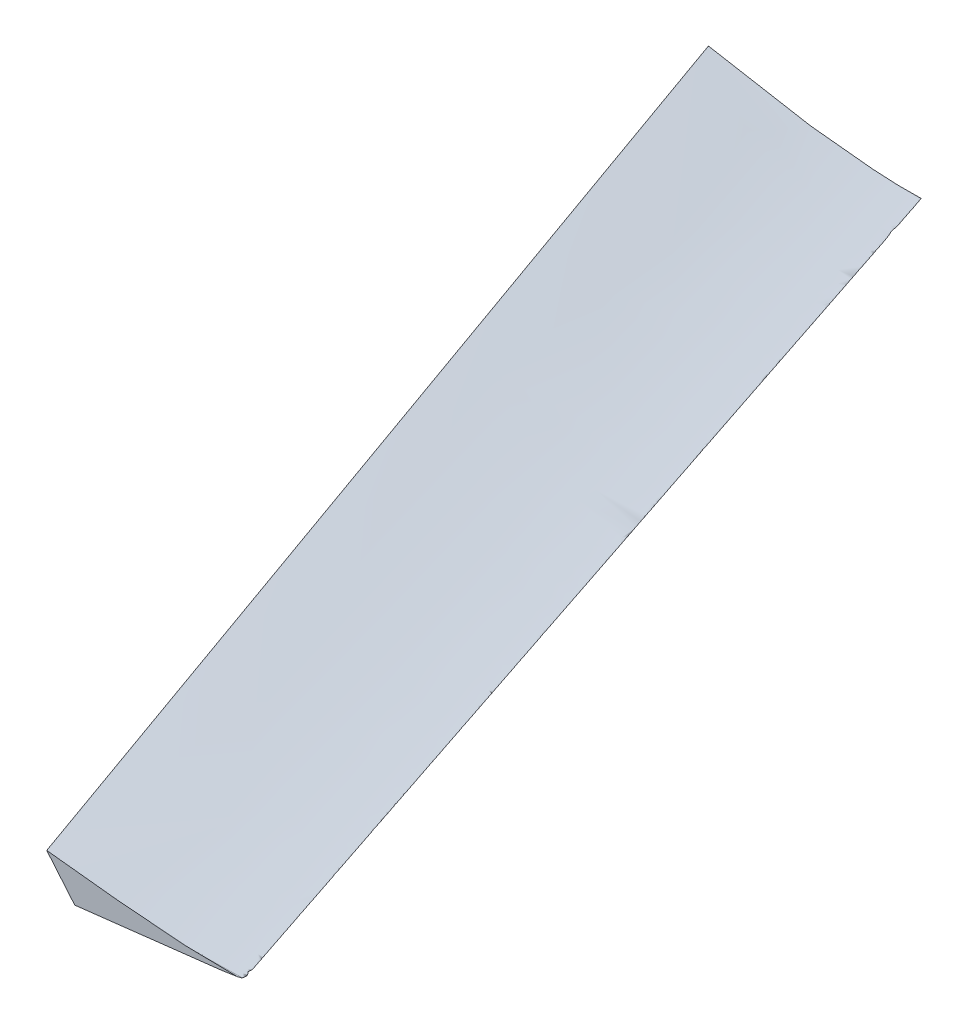
ISO-10303-21;
HEADER;
FILE_DESCRIPTION(('STEP AP214'),'2;1');
FILE_NAME('part.step','',(''),(''),'','','');
FILE_SCHEMA(('AUTOMOTIVE_DESIGN { 1 0 10303 214 1 1 1 1 }'));
ENDSEC;
DATA;
#1=APPLICATION_CONTEXT('core data for automotive mechanical design processes');
#2=APPLICATION_PROTOCOL_DEFINITION('international standard','automotive_design',2000,#1);
#3=PRODUCT_CONTEXT('',#1,'mechanical');
#4=PRODUCT('Part','Part','',(#3));
#5=PRODUCT_RELATED_PRODUCT_CATEGORY('part','',(#4));
#6=PRODUCT_DEFINITION_FORMATION('','',#4);
#7=PRODUCT_DEFINITION_CONTEXT('part definition',#1,'design');
#8=PRODUCT_DEFINITION('design','',#6,#7);
#9=PRODUCT_DEFINITION_SHAPE('','',#8);
#10=(LENGTH_UNIT() NAMED_UNIT(*) SI_UNIT(.MILLI.,.METRE.));
#11=(NAMED_UNIT(*) PLANE_ANGLE_UNIT() SI_UNIT($,.RADIAN.));
#12=(NAMED_UNIT(*) SI_UNIT($,.STERADIAN.) SOLID_ANGLE_UNIT());
#13=UNCERTAINTY_MEASURE_WITH_UNIT(LENGTH_MEASURE(1.E-05),#10,'distance_accuracy_value','');
#14=(GEOMETRIC_REPRESENTATION_CONTEXT(3) GLOBAL_UNCERTAINTY_ASSIGNED_CONTEXT((#13)) GLOBAL_UNIT_ASSIGNED_CONTEXT((#10,
#11,#12)) REPRESENTATION_CONTEXT('',''));
#15=CARTESIAN_POINT('',(0.,0.,0.));
#16=DIRECTION('',(0.,0.,1.));
#17=DIRECTION('',(1.,0.,0.));
#18=AXIS2_PLACEMENT_3D('',#15,#16,#17);
#19=CARTESIAN_POINT('',(147.438370518184,-8.47646655943486,155.));
#20=DIRECTION('',(0.,0.,-1.));
#21=DIRECTION('',(1.,0.,0.));
#22=AXIS2_PLACEMENT_3D('',#19,#20,#21);
#23=PLANE('',#22);
#24=CARTESIAN_POINT('',(118.294533078504,5.03413334682976,155.));
#25=CARTESIAN_POINT('',(118.722134351156,4.95738753147905,155.));
#26=CARTESIAN_POINT('',(119.149597273463,4.87988003652486,155.));
#27=CARTESIAN_POINT('',(120.004355283517,4.72395802546481,155.));
#28=CARTESIAN_POINT('',(120.431650372237,4.64554351471013,155.));
#29=CARTESIAN_POINT('',(121.287203689168,4.48823588576824,155.));
#30=CARTESIAN_POINT('',(121.715461788854,4.40934207262471,155.));
#31=CARTESIAN_POINT('',(122.357891040809,4.29122477819234,155.));
#32=CARTESIAN_POINT('',(122.572041585154,4.2518895030778,155.));
#33=CARTESIAN_POINT('',(123.000371796704,4.17337786223781,155.));
#34=CARTESIAN_POINT('',(123.214551463908,4.13420149650574,155.));
#35=CARTESIAN_POINT('',(123.857806068991,4.01673750718859,155.));
#36=CARTESIAN_POINT('',(124.286915713862,3.93864015988904,155.));
#37=CARTESIAN_POINT('',(125.145118515525,3.78238819689458,155.));
#38=CARTESIAN_POINT('',(125.574211672463,3.70423358199812,155.));
#39=CARTESIAN_POINT('',(126.217944856252,3.58655084410102,155.));
#40=CARTESIAN_POINT('',(126.43262316846,3.54723247337587,155.));
#41=CARTESIAN_POINT('',(126.86193532435,3.46835339816911,155.));
#42=CARTESIAN_POINT('',(127.076569168019,3.42879269361208,155.));
#43=CARTESIAN_POINT('',(127.505819239835,3.34951824336762,155.));
#44=CARTESIAN_POINT('',(127.720435466646,3.30980449044168,155.));
#45=CARTESIAN_POINT('',(128.149730120651,3.23071529456583,155.));
#46=CARTESIAN_POINT('',(128.364408547816,3.19133985145891,155.));
#47=CARTESIAN_POINT('',(129.008715620728,3.07434741277847,155.));
#48=CARTESIAN_POINT('',(129.438554441032,2.9978759494489,155.));
#49=CARTESIAN_POINT('',(130.299321596566,2.85148393035688,155.));
#50=CARTESIAN_POINT('',(130.730249799191,2.78156261331112,155.));
#51=CARTESIAN_POINT('',(131.376999445283,2.68445613268592,155.));
#52=CARTESIAN_POINT('',(131.592245077543,2.65343329852374,155.));
#53=CARTESIAN_POINT('',(132.023037688088,2.59355436992491,155.));
#54=CARTESIAN_POINT('',(132.238584668969,2.56469829427734,155.));
#55=CARTESIAN_POINT('',(132.669922448194,2.50869702514186,155.));
#56=CARTESIAN_POINT('',(132.885713269599,2.48155201020834,155.));
#57=CARTESIAN_POINT('',(133.317451425936,2.42854595029673,155.));
#58=CARTESIAN_POINT('',(133.53339876068,2.40268490378099,155.));
#59=CARTESIAN_POINT('',(133.965308563539,2.35182376545776,155.));
#60=CARTESIAN_POINT('',(134.181270992716,2.32682334094127,155.));
#61=CARTESIAN_POINT('',(134.613244438673,2.27724748265623,155.));
#62=CARTESIAN_POINT('',(134.829255455435,2.25267204874488,155.));
#63=CARTESIAN_POINT('',(135.261333567887,2.20408663831893,155.));
#64=CARTESIAN_POINT('',(135.477400661338,2.18007664196206,155.));
#65=CARTESIAN_POINT('',(135.909611746712,2.13275924865593,155.));
#66=CARTESIAN_POINT('',(136.125755738591,2.10945185129009,155.));
#67=CARTESIAN_POINT('',(136.558040522575,2.06368713839894,155.));
#68=CARTESIAN_POINT('',(136.774181276529,2.04122946363668,155.));
#69=CARTESIAN_POINT('',(137.206562788929,1.99729987004272,155.));
#70=CARTESIAN_POINT('',(137.422803547367,1.97582795112031,155.));
#71=CARTESIAN_POINT('',(138.071686730894,1.91316154896177,155.));
#72=CARTESIAN_POINT('',(138.504500608302,1.87371528719524,155.));
#73=CARTESIAN_POINT('',(139.153908524206,1.81840386186655,155.));
#74=CARTESIAN_POINT('',(139.370340243716,1.80061475264826,155.));
#75=CARTESIAN_POINT('',(139.803309583635,1.76637592250135,155.));
#76=CARTESIAN_POINT('',(140.019847204055,1.74992620169757,155.));
#77=CARTESIAN_POINT('',(140.669633148967,1.70254725603041,155.));
#78=CARTESIAN_POINT('',(141.103027368372,1.67359056256084,155.));
#79=CARTESIAN_POINT('',(141.753253244925,1.63397854563836,155.));
#80=CARTESIAN_POINT('',(141.969971157509,1.6214139945194,155.));
#81=CARTESIAN_POINT('',(142.40347883284,1.59752531617258,155.));
#82=CARTESIAN_POINT('',(142.620268596489,1.58620120515714,155.));
#83=CARTESIAN_POINT('',(143.053907648426,1.56515668463737,155.));
#84=CARTESIAN_POINT('',(143.270756929611,1.5554361310428,155.));
#85=CARTESIAN_POINT('',(143.704551935234,1.53851204823737,155.));
#86=CARTESIAN_POINT('',(143.921497656362,1.53130843846665,155.));
#87=CARTESIAN_POINT('',(144.20632934326,1.5240546866047,155.));
#88=CARTESIAN_POINT('',(144.274177636297,1.5224909151184,155.));
#89=CARTESIAN_POINT('',(144.409881622702,1.51971073378785,155.));
#90=CARTESIAN_POINT('',(144.477737316097,1.51849432523577,155.));
#91=CARTESIAN_POINT('',(144.681311727926,1.51535430210008,155.));
#92=CARTESIAN_POINT('',(144.817038480793,1.51393987216266,155.));
#93=CARTESIAN_POINT('',(145.224268650175,1.51143035602844,155.));
#94=CARTESIAN_POINT('',(145.495781353361,1.51206998598364,155.));
#95=CARTESIAN_POINT('',(145.835149742296,1.51414071324945,155.));
#96=CARTESIAN_POINT('',(145.903017103177,1.51461837354399,155.));
#97=CARTESIAN_POINT('',(146.03875332647,1.51561625208532,155.));
#98=CARTESIAN_POINT('',(146.106622188881,1.51613647127661,155.));
#99=CARTESIAN_POINT('',(146.242342633458,1.51763810755903,155.));
#100=CARTESIAN_POINT('',(146.310194216447,1.51861943650352,155.));
#101=CARTESIAN_POINT('',(146.445876162957,1.52152690471717,155.));
#102=CARTESIAN_POINT('',(146.513706527491,1.52345298839062,155.));
#103=CARTESIAN_POINT('',(146.615416320872,1.52738561707551,155.));
#104=CARTESIAN_POINT('',(146.64931596047,1.52887054874552,155.));
#105=CARTESIAN_POINT('',(146.71709895012,1.5321956737225,155.));
#106=CARTESIAN_POINT('',(146.750982299607,1.53403587856976,155.));
#107=CARTESIAN_POINT('',(146.818739332284,1.53806356371472,155.));
#108=CARTESIAN_POINT('',(146.852613008707,1.54025115716496,155.));
#109=CARTESIAN_POINT('',(146.920337796997,1.54488069304899,155.));
#110=CARTESIAN_POINT('',(146.95418891133,1.54732260038819,155.));
#111=CARTESIAN_POINT('',(147.004969903701,1.55087986375935,155.));
#112=CARTESIAN_POINT('',(147.021896008396,1.5520479123484,155.));
#113=CARTESIAN_POINT('',(147.055761882075,1.55429402977344,155.));
#114=CARTESIAN_POINT('',(147.072701653766,1.55537205716337,155.));
#115=CARTESIAN_POINT('',(147.106600189022,1.5573423716742,155.));
#116=CARTESIAN_POINT('',(147.123558957514,1.55823458287718,155.));
#117=CARTESIAN_POINT('',(147.149004785769,1.55923615003901,155.));
#118=CARTESIAN_POINT('',(147.157485052487,1.55951384265867,155.));
#119=CARTESIAN_POINT('',(147.174449338893,1.55984159740659,155.));
#120=CARTESIAN_POINT('',(147.182933356149,1.55989174104208,155.));
#121=CARTESIAN_POINT('',(147.199958196176,1.55954910362624,155.));
#122=CARTESIAN_POINT('',(147.20849895642,1.55915292771675,155.));
#123=CARTESIAN_POINT('',(147.225507783826,1.55736284187332,155.));
#124=CARTESIAN_POINT('',(147.233975953454,1.55597071230197,155.));
#125=CARTESIAN_POINT('',(147.244251907439,1.55309915979963,155.));
#126=CARTESIAN_POINT('',(147.246296686387,1.55246645988532,155.));
#127=CARTESIAN_POINT('',(147.250311347355,1.55100447897397,155.));
#128=CARTESIAN_POINT('',(147.252281619853,1.55017646064803,155.));
#129=CARTESIAN_POINT('',(147.255047946984,1.54860341350373,155.));
#130=CARTESIAN_POINT('',(147.255934543259,1.54802761231689,155.));
#131=CARTESIAN_POINT('',(147.257332382365,1.54683886832212,155.));
#132=CARTESIAN_POINT('',(147.257880943191,1.54627579970369,155.));
#133=CARTESIAN_POINT('',(147.258546086327,1.54525710603691,155.));
#134=CARTESIAN_POINT('',(147.258746772625,1.54486133394074,155.));
#135=CARTESIAN_POINT('',(147.258977937464,1.54409212849169,155.));
#136=CARTESIAN_POINT('',(147.259031831159,1.5437266478336,155.));
#137=CARTESIAN_POINT('',(147.259003759522,1.54299977597194,155.));
#138=CARTESIAN_POINT('',(147.258921501426,1.54263839526753,155.));
#139=CARTESIAN_POINT('',(147.258607781224,1.54183983428208,155.));
#140=CARTESIAN_POINT('',(147.258333714882,1.54142129490039,155.));
#141=CARTESIAN_POINT('',(147.257420469428,1.54031000107344,155.));
#142=CARTESIAN_POINT('',(147.256676331133,1.53971553630924,155.));
#143=CARTESIAN_POINT('',(147.254412688546,1.53816273439151,155.));
#144=CARTESIAN_POINT('',(147.252801245235,1.53736234711579,155.));
#145=CARTESIAN_POINT('',(147.249505943685,1.53591429131804,155.));
#146=CARTESIAN_POINT('',(147.247821693566,1.53526761551519,155.));
#147=CARTESIAN_POINT('',(147.242768558404,1.53347462774439,155.));
#148=CARTESIAN_POINT('',(147.239355342395,1.53245453484511,155.));
#149=CARTESIAN_POINT('',(147.232488610491,1.53055836330209,155.));
#150=CARTESIAN_POINT('',(147.229035050834,1.52968246039611,155.));
#151=CARTESIAN_POINT('',(147.218669581707,1.52718237145803,155.));
#152=CARTESIAN_POINT('',(147.211728526109,1.52567871157955,155.));
#153=CARTESIAN_POINT('',(147.190917252813,1.52136027203338,155.));
#154=CARTESIAN_POINT('',(147.17701161785,1.51872648190208,155.));
#155=CARTESIAN_POINT('',(147.149161870291,1.51364350594954,155.));
#156=CARTESIAN_POINT('',(147.135217745434,1.51119438831725,155.));
#157=CARTESIAN_POINT('',(147.107303730777,1.50639494987191,155.));
#158=CARTESIAN_POINT('',(147.093333830351,1.50404469139674,155.));
#159=CARTESIAN_POINT('',(147.065387137209,1.49939825204936,155.));
#160=CARTESIAN_POINT('',(147.051410345765,1.49710206348511,155.));
#161=CARTESIAN_POINT('',(147.009491169889,1.4902554805535,155.));
#162=CARTESIAN_POINT('',(146.981542431965,1.48574413497746,155.));
#163=CARTESIAN_POINT('',(146.925658674138,1.47663742038238,155.));
#164=CARTESIAN_POINT('',(146.897723654212,1.47204205151069,155.));
#165=CARTESIAN_POINT('',(146.813938527748,1.45812014694574,155.));
#166=CARTESIAN_POINT('',(146.758110880868,1.44865821632409,155.));
#167=CARTESIAN_POINT('',(146.64652721997,1.42945169478566,155.));
#168=CARTESIAN_POINT('',(146.590771186382,1.41970721685119,155.));
#169=CARTESIAN_POINT('',(146.479267373244,1.40017206895025,155.));
#170=CARTESIAN_POINT('',(146.423519593685,1.39038139902543,155.));
#171=CARTESIAN_POINT('',(146.311971678462,1.37099734750688,155.));
#172=CARTESIAN_POINT('',(146.256171531955,1.36140402767139,155.));
#173=CARTESIAN_POINT('',(146.144506011253,1.34260474642733,155.));
#174=CARTESIAN_POINT('',(146.088640637125,1.33339878463074,155.));
#175=CARTESIAN_POINT('',(145.976863328089,1.315272680416,155.));
#176=CARTESIAN_POINT('',(145.920951392825,1.30635254019877,155.));
#177=CARTESIAN_POINT('',(145.809091692999,1.28873899682101,155.));
#178=CARTESIAN_POINT('',(145.753143928327,1.28004559436253,155.));
#179=CARTESIAN_POINT('',(145.585252674558,1.25423028888888,155.));
#180=CARTESIAN_POINT('',(145.473268322073,1.23737442500892,155.));
#181=CARTESIAN_POINT('',(145.249233027821,1.20411498225193,155.));
#182=CARTESIAN_POINT('',(145.137182086105,1.18771140302352,155.));
#183=CARTESIAN_POINT('',(144.800917533843,1.13885188709731,155.));
#184=CARTESIAN_POINT('',(144.576651657459,1.10675607207976,155.));
#185=CARTESIAN_POINT('',(144.128046364348,1.04315136888247,155.));
#186=CARTESIAN_POINT('',(143.903706950953,1.01164245707364,155.));
#187=CARTESIAN_POINT('',(143.380328615909,0.938380444714113,155.));
#188=CARTESIAN_POINT('',(143.081278410614,0.896708134729135,155.));
#189=CARTESIAN_POINT('',(142.483166184232,0.81344885322592,155.));
#190=CARTESIAN_POINT('',(142.184104163147,0.771861881698608,155.));
#191=CARTESIAN_POINT('',(141.286916139098,0.647051516032773,155.));
#192=CARTESIAN_POINT('',(140.688796805778,0.563779869522637,155.));
#193=CARTESIAN_POINT('',(139.492694548857,0.396267704833501,155.));
#194=CARTESIAN_POINT('',(138.894711625007,0.312027188431022,155.));
#195=CARTESIAN_POINT('',(137.997924272933,0.184659581411959,155.));
#196=CARTESIAN_POINT('',(137.699047874041,0.142039016799618,155.));
#197=CARTESIAN_POINT('',(137.101340619455,0.0564769381409336,155.));
#198=CARTESIAN_POINT('',(136.80250976382,0.0135354236740053,155.));
#199=CARTESIAN_POINT('',(136.204893778603,-0.0726638973790839,155.));
#200=CARTESIAN_POINT('',(135.906108649007,-0.115921703864923,155.));
#201=CARTESIAN_POINT('',(135.308583126107,-0.202733871468216,155.));
#202=CARTESIAN_POINT('',(135.00984273257,-0.246288230975116,155.));
#203=CARTESIAN_POINT('',(134.412416601587,-0.333746917327035,155.));
#204=CARTESIAN_POINT('',(134.113730863562,-0.377651240207376,155.));
#205=CARTESIAN_POINT('',(133.516418500982,-0.465909909551579,155.));
#206=CARTESIAN_POINT('',(133.217791878013,-0.510264266765364,155.));
#207=CARTESIAN_POINT('',(132.778658096206,-0.575893112194497,155.));
#208=CARTESIAN_POINT('',(132.638119560358,-0.596957756260566,155.));
#209=CARTESIAN_POINT('',(132.357061315948,-0.639213824665974,155.));
#210=CARTESIAN_POINT('',(132.216541607417,-0.660405249203714,155.));
#211=CARTESIAN_POINT('',(131.93552343538,-0.702933875924057,155.));
#212=CARTESIAN_POINT('',(131.795024971999,-0.724271078935069,155.));
#213=CARTESIAN_POINT('',(131.514045583331,-0.767055863487099,155.));
#214=CARTESIAN_POINT('',(131.37356465796,-0.788503444481861,155.));
#215=CARTESIAN_POINT('',(131.162846118694,-0.820661794101035,155.));
#216=CARTESIAN_POINT('',(131.092609441846,-0.831378713557785,155.));
#217=CARTESIAN_POINT('',(130.952140822894,-0.852842706495045,155.));
#218=CARTESIAN_POINT('',(130.881908880782,-0.863589779920231,155.));
#219=CARTESIAN_POINT('',(130.741455109026,-0.885156532428961,155.));
#220=CARTESIAN_POINT('',(130.671233279538,-0.8959762125369,155.));
#221=CARTESIAN_POINT('',(130.530803391833,-0.917706720662761,155.));
#222=CARTESIAN_POINT('',(130.460595333686,-0.928617549138942,155.));
#223=CARTESIAN_POINT('',(130.320162115885,-0.950291073012209,155.));
#224=CARTESIAN_POINT('',(130.249936958109,-0.961053780504158,155.));
#225=CARTESIAN_POINT('',(130.109428422132,-0.982190416712054,155.));
#226=CARTESIAN_POINT('',(130.039145044546,-0.992564349479514,155.));
#227=CARTESIAN_POINT('',(129.898500562626,-1.01275248649838,155.));
#228=CARTESIAN_POINT('',(129.828139461293,-1.02256671163452,155.));
#229=CARTESIAN_POINT('',(129.687354452961,-1.04173667542309,155.));
#230=CARTESIAN_POINT('',(129.616930545385,-1.05109240981511,155.));
#231=CARTESIAN_POINT('',(129.405586237507,-1.07856931379022,155.));
#232=CARTESIAN_POINT('',(129.264589235732,-1.09610075198849,155.));
#233=CARTESIAN_POINT('',(128.982472116199,-1.13017689385424,155.));
#234=CARTESIAN_POINT('',(128.84135199363,-1.14672155704373,155.));
#235=CARTESIAN_POINT('',(128.559047428154,-1.1794039275569,155.));
#236=CARTESIAN_POINT('',(128.417862979471,-1.19554158459143,155.));
#237=CARTESIAN_POINT('',(128.206102362516,-1.21987704526255,155.));
#238=CARTESIAN_POINT('',(128.135518796586,-1.22801028811787,155.));
#239=CARTESIAN_POINT('',(127.994364991549,-1.2443915976272,155.));
#240=CARTESIAN_POINT('',(127.923794752439,-1.25263966425864,155.));
#241=CARTESIAN_POINT('',(127.712094504929,-1.27754464699498,155.));
#242=CARTESIAN_POINT('',(127.570983286696,-1.29436139257661,155.));
#243=CARTESIAN_POINT('',(127.288804100602,-1.32836109453651,155.));
#244=CARTESIAN_POINT('',(127.147736133035,-1.34554405335766,155.));
#245=CARTESIAN_POINT('',(126.724587048775,-1.39755178901117,155.));
#246=CARTESIAN_POINT('',(126.44256234539,-1.43283523602967,155.));
#247=CARTESIAN_POINT('',(125.878642492745,-1.50413181352084,155.));
#248=CARTESIAN_POINT('',(125.596747331514,-1.54014484991252,155.));
#249=CARTESIAN_POINT('',(125.03299064279,-1.61243588399251,155.));
#250=CARTESIAN_POINT('',(124.751129115349,-1.64871388208589,155.));
#251=CARTESIAN_POINT('',(124.187374785953,-1.72099389949002,155.));
#252=CARTESIAN_POINT('',(123.905481984521,-1.75699592286288,155.));
#253=CARTESIAN_POINT('',(123.341634624741,-1.82851187575915,155.));
#254=CARTESIAN_POINT('',(123.059680066427,-1.86402580555356,155.));
#255=CARTESIAN_POINT('',(122.495728694531,-1.93471439261515,155.));
#256=CARTESIAN_POINT('',(122.213731880979,-1.96988905011835,155.));
#257=CARTESIAN_POINT('',(121.64970478995,-2.03996966298415,155.));
#258=CARTESIAN_POINT('',(121.367674512462,-2.07487561825928,155.));
#259=CARTESIAN_POINT('',(120.521548738229,-2.17934624739121,155.));
#260=CARTESIAN_POINT('',(119.957422686189,-2.24866313774173,155.));
#261=CARTESIAN_POINT('',(119.301729275235,-2.32917765685364,155.));
#262=CARTESIAN_POINT('',(119.210167307658,-2.34041960273597,155.));
#263=CARTESIAN_POINT('',(119.027042456309,-2.36289513526822,155.));
#264=CARTESIAN_POINT('',(118.935479572537,-2.37412872192807,155.));
#265=CARTESIAN_POINT('',(118.752353592887,-2.3965869517364,155.));
#266=CARTESIAN_POINT('',(118.660790497019,-2.40781159496899,155.));
#267=CARTESIAN_POINT('',(118.477662883011,-2.43025020363746,155.));
#268=CARTESIAN_POINT('',(118.38609836487,-2.44146416906023,155.));
#269=CARTESIAN_POINT('',(118.294533078504,-2.45267186114703,155.));
#270=B_SPLINE_CURVE_WITH_KNOTS('',3,(#24,#25,#26,#27,#28,#29,#30,#31,#32,#33,#34,#35,#36,#37,
#38,#39,#40,#41,#42,#43,#44,#45,#46,#47,#48,#49,#50,#51,#52,#53,#54,#55,#56,#57,#58,#59,#60,#61,
#62,#63,#64,#65,#66,#67,#68,#69,#70,#71,#72,#73,#74,#75,#76,#77,#78,#79,#80,#81,#82,#83,#84,#85,
#86,#87,#88,#89,#90,#91,#92,#93,#94,#95,#96,#97,#98,#99,#100,#101,#102,#103,#104,#105,#106,#107,
#108,#109,#110,#111,#112,#113,#114,#115,#116,#117,#118,#119,#120,#121,#122,#123,#124,#125,#126,
#127,#128,#129,#130,#131,#132,#133,#134,#135,#136,#137,#138,#139,#140,#141,#142,#143,#144,#145,
#146,#147,#148,#149,#150,#151,#152,#153,#154,#155,#156,#157,#158,#159,#160,#161,#162,#163,#164,
#165,#166,#167,#168,#169,#170,#171,#172,#173,#174,#175,#176,#177,#178,#179,#180,#181,#182,#183,
#184,#185,#186,#187,#188,#189,#190,#191,#192,#193,#194,#195,#196,#197,#198,#199,#200,#201,#202,
#203,#204,#205,#206,#207,#208,#209,#210,#211,#212,#213,#214,#215,#216,#217,#218,#219,#220,#221,
#222,#223,#224,#225,#226,#227,#228,#229,#230,#231,#232,#233,#234,#235,#236,#237,#238,#239,#240,
#241,#242,#243,#244,#245,#246,#247,#248,#249,#250,#251,#252,#253,#254,#255,#256,#257,#258,#259,
#260,#261,#262,#263,#264,#265,#266,#267,#268,#269),.UNSPECIFIED.,.F.,.F.,(4,2,2,2,2,2,2,2,2,2,2,
2,2,2,2,2,2,2,2,2,2,2,2,2,2,2,2,2,2,2,2,2,2,2,2,2,2,2,2,2,2,2,2,2,2,2,2,2,2,2,2,2,2,2,2,2,2,2,2,
2,2,2,2,2,2,2,2,2,2,2,2,2,2,2,2,2,2,2,2,2,2,2,2,2,2,2,2,2,2,2,2,2,2,2,2,2,2,2,2,2,2,2,2,2,2,2,2,
2,2,2,2,2,2,2,2,2,2,2,2,2,2,2,4),(0.,1.30329865663614,2.60658962801915,3.91298294887532,
4.56618231326972,5.21938165046397,6.52785723993872,7.83631492085104,8.49106239525552,
9.14581007346351,9.8005891080149,10.4553678386728,11.7651134182726,13.0747065848294,
13.7271021323329,14.3795033364437,15.0319725082855,15.6844408987308,16.3366541512538,
16.9888671846336,17.6410572964341,18.293247021546,18.9451578675693,19.5970686535944,
20.9008584126208,21.5523395982812,22.2038208446599,23.5068651933746,24.1581082219166,
24.809359761117,25.4605527491474,26.1117248925276,26.315323096707,26.5189220582563,
26.9261178724075,27.7406313860429,27.9442389938768,28.147851121556,28.3514243421709,
28.5549855846102,28.6567802316165,28.7585781857564,28.8604093661256,28.9622265126543,
29.013125387661,29.064047568945,29.11499051459,29.14044426085,29.1658888889494,29.1915283720248,
29.2171221362232,29.2235419990062,29.2299214449506,29.2330795081676,29.2354044189919,
29.2367177246666,29.2378041469231,29.2388929083256,29.2403682206498,29.2431897901041,
29.2485663567478,29.2539767569117,29.2646524625468,29.2753410848382,29.2966423024857,
29.3390987972532,29.3815708927682,29.4240693803744,29.4665617851277,29.5514932087083,
29.6364244833738,29.8062947074208,29.9760979175164,30.1459009745197,30.3157563848673,
30.4856116250582,30.6554681728692,30.8253252465417,31.1650609541441,31.5047963977986,
32.1844476541786,32.864071487971,33.7698906403792,34.6757096964524,36.4873739484612,
38.29903487913,39.2047347281032,40.1104357641507,41.0161365129403,41.9218323468618,
42.8275179348423,43.7332252080108,44.1595503826284,44.5858762245849,45.0122044912206,
45.4385306500073,45.6516793969574,45.8648277530923,46.0779791228501,46.2911315648966,
46.5042664973955,46.7173992081463,46.9305239609325,47.1436506937544,47.5698919914017,
47.9961507616589,48.4224619443876,48.6356137280686,48.8487654698548,49.2750940776904,
49.7014255303066,50.5540932535792,51.4066517159984,52.2592114820608,53.1117586750193,
53.9643053946105,54.8168515210925,55.6693979250973,57.3745039943801,57.6512525773118,
57.9280008309565,58.2047464506167,58.4814924096157),.UNSPECIFIED.);
#271=CARTESIAN_POINT('',(118.294533078504,5.03413334682976,155.));
#272=VERTEX_POINT('',#271);
#273=CARTESIAN_POINT('',(123.984469549347,-1.74686888393027,155.));
#274=VERTEX_POINT('',#273);
#275=EDGE_CURVE('E66',#272,#274,#270,.T.);
#276=ORIENTED_EDGE('',*,*,#275,.T.);
#277=DIRECTION('',(0.642787609686432,-0.766044443119067,0.));
#278=VECTOR('',#277,1.);
#279=CARTESIAN_POINT('',(136.988736435298,-17.2447506643198,155.));
#280=LINE('',#279,#278);
#281=EDGE_CURVE('E70',#272,#274,#280,.T.);
#282=ORIENTED_EDGE('',*,*,#281,.F.);
#283=EDGE_LOOP('',(#276,#282));
#284=FACE_BOUND('',#283,.T.);
#285=ADVANCED_FACE('F34',(#284),#23,.T.);
#286=CARTESIAN_POINT('',(120.01366860982,-1.04648911540753,310.));
#287=CARTESIAN_POINT('',(0.013316006798513,-0.0312186495013583,0.));
#288=CARTESIAN_POINT('',(120.014046888793,-1.05429541944579,310.));
#289=CARTESIAN_POINT('',(0.0174292532795909,-0.0407917543541427,0.));
#290=CARTESIAN_POINT('',(120.015393329514,-1.06813940521298,310.));
#291=CARTESIAN_POINT('',(0.0285057041957596,-0.0588877597923364,0.));
#292=CARTESIAN_POINT('',(120.023357249491,-1.10681188589641,310.));
#293=CARTESIAN_POINT('',(0.0534899553637254,-0.109205300114085,0.));
#294=CARTESIAN_POINT('',(120.052969423917,-1.16363191938981,310.));
#295=CARTESIAN_POINT('',(0.0718403065978395,-0.184724903591237,0.));
#296=CARTESIAN_POINT('',(120.090002702522,-1.20687573939254,310.));
#297=CARTESIAN_POINT('',(0.0735553357145724,-0.25021740924566,0.));
#298=CARTESIAN_POINT('',(120.150006565019,-1.26936906218135,310.));
#299=CARTESIAN_POINT('',(0.0833434349624817,-0.351491299971139,0.));
#300=CARTESIAN_POINT('',(120.219318263675,-1.32827605996123,310.));
#301=CARTESIAN_POINT('',(0.107276767133772,-0.460057187942828,0.));
#302=CARTESIAN_POINT('',(120.319251010221,-1.39917530013747,310.));
#303=CARTESIAN_POINT('',(0.153157549863647,-0.606679447480497,0.));
#304=CARTESIAN_POINT('',(120.45306411407,-1.48454755958866,310.));
#305=CARTESIAN_POINT('',(0.215615516019219,-0.792659147959301,0.));
#306=CARTESIAN_POINT('',(120.593037643893,-1.56175955515646,310.));
#307=CARTESIAN_POINT('',(0.286075026160848,-0.973190735690143,0.));
#308=CARTESIAN_POINT('',(120.784628291651,-1.65577100065921,310.));
#309=CARTESIAN_POINT('',(0.398469293954049,-1.20831850913467,0.));
#310=CARTESIAN_POINT('',(121.146568779959,-1.81608160396861,310.));
#311=CARTESIAN_POINT('',(0.636079218312484,-1.63309260433163,0.));
#312=CARTESIAN_POINT('',(121.6827692727,-1.99311399079102,310.));
#313=CARTESIAN_POINT('',(1.06215467500723,-2.17811659564988,0.));
#314=CARTESIAN_POINT('',(122.412641156803,-2.19029822697117,310.));
#315=CARTESIAN_POINT('',(1.7293251410862,-2.82961784353203,0.));
#316=CARTESIAN_POINT('',(123.127051622743,-2.34874150969003,310.));
#317=CARTESIAN_POINT('',(2.42347189674124,-3.39941080488008,0.));
#318=CARTESIAN_POINT('',(123.989720017309,-2.5087231236722,310.));
#319=CARTESIAN_POINT('',(3.30809513975672,-4.0093737891588,0.));
#320=CARTESIAN_POINT('',(124.848078976432,-2.63856140611154,310.));
#321=CARTESIAN_POINT('',(4.23081446296205,-4.53834495592897,0.));
#322=CARTESIAN_POINT('',(125.899538864817,-2.7703578050836,310.));
#323=CARTESIAN_POINT('',(5.39898476603306,-5.10823191595177,0.));
#324=CARTESIAN_POINT('',(126.871847001067,-2.86664030585305,310.));
#325=CARTESIAN_POINT('',(6.50475943522197,-5.56731897123595,0.));
#326=CARTESIAN_POINT('',(128.129702124495,-2.96527868985964,310.));
#327=CARTESIAN_POINT('',(7.96167788281998,-6.08266893710235,0.));
#328=CARTESIAN_POINT('',(129.192179965154,-3.02552412327866,310.));
#329=CARTESIAN_POINT('',(9.21384231754378,-6.44611608741912,0.));
#330=CARTESIAN_POINT('',(130.66784654871,-3.08419765404375,310.));
#331=CARTESIAN_POINT('',(10.9719155279951,-6.87311467457479,0.));
#332=CARTESIAN_POINT('',(131.80596156873,-3.10882644697258,310.));
#333=CARTESIAN_POINT('',(12.3403895985504,-7.1406441322593,0.));
#334=CARTESIAN_POINT('',(133.504607778707,-3.12234039812759,310.));
#335=CARTESIAN_POINT('',(14.394387303446,-7.47007790906888,0.));
#336=CARTESIAN_POINT('',(134.707832482699,-3.11404137693987,310.));
#337=CARTESIAN_POINT('',(15.8568212674822,-7.65188771237696,0.));
#338=CARTESIAN_POINT('',(136.623010137688,-3.07860841823112,310.));
#339=CARTESIAN_POINT('',(18.1914050686211,-7.87877203688736,0.));
#340=CARTESIAN_POINT('',(137.88344022738,-3.03952579990548,310.));
#341=CARTESIAN_POINT('',(19.7320444356359,-7.98466244874083,0.));
#342=CARTESIAN_POINT('',(140.001173004115,-2.95381121627616,310.));
#343=CARTESIAN_POINT('',(22.3242901174527,-8.10838176318687,0.));
#344=CARTESIAN_POINT('',(141.311272715403,-2.88746336139696,310.));
#345=CARTESIAN_POINT('',(23.9301081333357,-8.1496790092672,0.));
#346=CARTESIAN_POINT('',(143.611706381719,-2.75288179737223,310.));
#347=CARTESIAN_POINT('',(26.7515225151429,-8.17058561597584,0.));
#348=CARTESIAN_POINT('',(144.962894004134,-2.66259063217827,310.));
#349=CARTESIAN_POINT('',(28.4096514577393,-8.15050581429984,0.));
#350=CARTESIAN_POINT('',(147.421937240402,-2.48366134435782,310.));
#351=CARTESIAN_POINT('',(31.4273708732748,-8.06870614044755,0.));
#352=CARTESIAN_POINT('',(148.803813136528,-2.37446112158057,310.));
#353=CARTESIAN_POINT('',(33.1231636782166,-7.99605731155391,0.));
#354=CARTESIAN_POINT('',(151.394320926611,-2.15766628588295,310.));
#355=CARTESIAN_POINT('',(36.3011347491819,-7.81975373322078,0.));
#356=CARTESIAN_POINT('',(152.795540205386,-2.03360408264609,310.));
#357=CARTESIAN_POINT('',(38.0195032283993,-7.70171185086234,0.));
#358=CARTESIAN_POINT('',(155.48769392512,-1.7868542054459,310.));
#359=CARTESIAN_POINT('',(41.3194684418979,-7.44382678259,0.));
#360=CARTESIAN_POINT('',(156.896291012846,-1.6532074966089,310.));
#361=CARTESIAN_POINT('',(43.0452516362978,-7.29212699081314,0.));
#362=CARTESIAN_POINT('',(159.653140621242,-1.38521142184203,310.));
#363=CARTESIAN_POINT('',(46.4211390017818,-6.96911896801072,0.));
#364=CARTESIAN_POINT('',(161.059338855311,-1.24516949559825,310.));
#365=CARTESIAN_POINT('',(48.1421790600076,-6.7907580892948,0.));
#366=CARTESIAN_POINT('',(163.832289232943,-0.964969002179905,310.));
#367=CARTESIAN_POINT('',(51.53405759773,-6.41721175368243,0.));
#368=CARTESIAN_POINT('',(165.239073913857,-0.82077231127184,310.));
#369=CARTESIAN_POINT('',(53.2538656413558,-6.21665851121559,0.));
#370=CARTESIAN_POINT('',(167.990283072325,-0.535579091870718,310.));
#371=CARTESIAN_POINT('',(56.6154659008731,-5.80649934545891,0.));
#372=CARTESIAN_POINT('',(169.393302713168,-0.388558372738801,310.));
#373=CARTESIAN_POINT('',(58.3288780495073,-5.58842448042761,0.));
#374=CARTESIAN_POINT('',(172.075398198016,-0.105561946561297,310.));
#375=CARTESIAN_POINT('',(61.6026342317588,-5.15710197308353,0.));
#376=CARTESIAN_POINT('',(173.455395361899,0.0409964854782851,310.));
#377=CARTESIAN_POINT('',(63.2862328436414,-4.9281935489299,0.));
#378=CARTESIAN_POINT('',(176.036410675095,0.316993746421452,310.));
#379=CARTESIAN_POINT('',(66.435433301091,-4.5000316758356,0.));
#380=CARTESIAN_POINT('',(177.374440150451,0.461008397863033,310.));
#381=CARTESIAN_POINT('',(68.0681229738932,-4.27761565112259,0.));
#382=CARTESIAN_POINT('',(179.822893137472,0.72587216829695,310.));
#383=CARTESIAN_POINT('',(71.0524612158436,-3.8482700473746,0.));
#384=CARTESIAN_POINT('',(181.101941784241,0.864879252251866,310.));
#385=CARTESIAN_POINT('',(72.6102313210399,-3.61560969878946,0.));
#386=CARTESIAN_POINT('',(182.843831823052,1.05547187503123,310.));
#387=CARTESIAN_POINT('',(74.7413908973079,-3.36012364142579,0.));
#388=CARTESIAN_POINT('',(183.610590914387,1.13964389570539,310.));
#389=CARTESIAN_POINT('',(75.6802109085149,-3.25222969366949,0.));
#390=CARTESIAN_POINT('',(184.492389330127,1.23676845955346,310.));
#391=CARTESIAN_POINT('',(76.7464834083599,-3.04389959481675,0.));
#392=CARTESIAN_POINT('',(185.036247584448,1.29676826731384,310.));
#393=CARTESIAN_POINT('',(77.404897369928,-2.9204998063374,0.));
#394=CARTESIAN_POINT('',(185.474109371304,1.34514761820157,310.));
#395=CARTESIAN_POINT('',(77.9350543728603,-2.82108075485167,0.));
#396=CARTESIAN_POINT('',(186.686318940767,1.47921875147728,310.));
#397=CARTESIAN_POINT('',(79.4032863582956,-2.54871571925276,0.));
#398=CARTESIAN_POINT('',(187.801945245297,1.60308846409442,310.));
#399=CARTESIAN_POINT('',(80.7564174197443,-2.30831621692385,0.));
#400=CARTESIAN_POINT('',(189.677926776495,1.81331808601154,310.));
#401=CARTESIAN_POINT('',(83.0339504586319,-1.91398766831358,0.));
#402=CARTESIAN_POINT('',(190.692725025536,1.92801379721801,310.));
#403=CARTESIAN_POINT('',(84.2667292227566,-1.7055261116304,0.));
#404=CARTESIAN_POINT('',(192.324177846106,2.11436909834869,310.));
#405=CARTESIAN_POINT('',(86.2498415238621,-1.379228585454,0.));
#406=CARTESIAN_POINT('',(193.222742883966,2.21796090914107,310.));
#407=CARTESIAN_POINT('',(87.3437905731365,-1.20353485682751,0.));
#408=CARTESIAN_POINT('',(194.595683478029,2.38032158156816,310.));
#409=CARTESIAN_POINT('',(89.0186106073786,-0.941298528290547,0.));
#410=CARTESIAN_POINT('',(195.377545126431,2.47486336237537,310.));
#411=CARTESIAN_POINT('',(89.9696593946396,-0.795228885945189,0.));
#412=CARTESIAN_POINT('',(196.457827652566,2.60903959546917,310.));
#413=CARTESIAN_POINT('',(91.2785520322142,-0.595979192614483,0.));
#414=CARTESIAN_POINT('',(197.085305992377,2.68870060851301,310.));
#415=CARTESIAN_POINT('',(92.0520809404372,-0.478910730170958,0.));
#416=CARTESIAN_POINT('',(197.901046639368,2.80172401166072,310.));
#417=CARTESIAN_POINT('',(93.0773352258477,-0.323819442421937,0.));
#418=CARTESIAN_POINT('',(198.438117360198,2.88107737015927,310.));
#419=CARTESIAN_POINT('',(93.7042372027148,-0.224821218229098,0.));
#420=CARTESIAN_POINT('',(198.90892403899,2.9587736400838,310.));
#421=CARTESIAN_POINT('',(94.1974027524316,-0.13214993337135,0.));
#422=CARTESIAN_POINT('',(199.166747464867,3.00577963189287,310.));
#423=CARTESIAN_POINT('',(94.6125565042133,-0.0624162943201398,0.));
#424=CARTESIAN_POINT('',(199.407549159536,3.05033863835893,310.));
#425=CARTESIAN_POINT('',(95.0846293477175,0.00537815838583609,0.));
#426=CARTESIAN_POINT('',(199.616871003396,3.08842318107141,310.));
#427=CARTESIAN_POINT('',(94.9136976846167,0.00198152290645719,0.));
#428=CARTESIAN_POINT('',(199.80595157938,3.12233125070792,310.));
#429=CARTESIAN_POINT('',(94.6753985118984,-0.0108563385193203,0.));
#430=CARTESIAN_POINT('',(199.949375584494,3.1509603372277,310.));
#431=CARTESIAN_POINT('',(94.3995350419762,-0.0219687402871612,0.));
#432=CARTESIAN_POINT('',(199.532168945951,3.09566806838545,310.));
#433=CARTESIAN_POINT('',(94.0785645110229,-0.0262668073132048,0.));
#434=CARTESIAN_POINT('',(199.134849231226,3.05408382107663,310.));
#435=CARTESIAN_POINT('',(93.7196981836267,-0.0161751330913563,0.));
#436=CARTESIAN_POINT('',(198.695509836483,3.0279870595741,310.));
#437=CARTESIAN_POINT('',(93.0772154696869,0.000269199857531552,0.));
#438=CARTESIAN_POINT('',(198.087936108196,2.99592055784662,310.));
#439=CARTESIAN_POINT('',(92.282680404422,0.0242705534887158,0.));
#440=CARTESIAN_POINT('',(197.16479213058,2.96005798519283,310.));
#441=CARTESIAN_POINT('',(91.1964225456261,0.0802541109723194,0.));
#442=CARTESIAN_POINT('',(196.369847696693,2.95113290491146,310.));
#443=CARTESIAN_POINT('',(90.2433123761032,0.152607060027319,0.));
#444=CARTESIAN_POINT('',(195.2355523494,2.95761956844333,310.));
#445=CARTESIAN_POINT('',(88.8435187634631,0.272921655287372,0.));
#446=CARTESIAN_POINT('',(194.246350580518,2.97401092263328,310.));
#447=CARTESIAN_POINT('',(87.6319052562092,0.390981235438394,0.));
#448=CARTESIAN_POINT('',(192.8323107026,3.01491549529872,310.));
#449=CARTESIAN_POINT('',(85.9157960395474,0.578891197811428,0.));
#450=CARTESIAN_POINT('',(191.669455395185,3.06566279112101,310.));
#451=CARTESIAN_POINT('',(84.5033174947188,0.75269790915514,0.));
#452=CARTESIAN_POINT('',(190.044630026077,3.15568464513122,310.));
#453=CARTESIAN_POINT('',(82.5277174083351,1.02281122736654,0.));
#454=CARTESIAN_POINT('',(188.725026097151,3.2432497327904,310.));
#455=CARTESIAN_POINT('',(80.925419802786,1.25998913972966,0.));
#456=CARTESIAN_POINT('',(187.056119887528,3.36871160165064,310.));
#457=CARTESIAN_POINT('',(78.8986247526863,1.56479549626288,0.));
#458=CARTESIAN_POINT('',(185.608238713758,3.48791479307948,310.));
#459=CARTESIAN_POINT('',(77.1445570823256,1.8601855801552,0.));
#460=CARTESIAN_POINT('',(183.712431628319,3.65636791856726,310.));
#461=CARTESIAN_POINT('',(74.8727924015168,2.37701215608921,0.));
#462=CARTESIAN_POINT('',(182.019967804139,3.81631486117564,310.));
#463=CARTESIAN_POINT('',(72.8587056020523,2.90973787024548,0.));
#464=CARTESIAN_POINT('',(180.004504317116,4.01396442097274,310.));
#465=CARTESIAN_POINT('',(70.4554097537484,3.5210154285861,0.));
#466=CARTESIAN_POINT('',(178.315160609659,4.1840680043231,310.));
#467=CARTESIAN_POINT('',(68.438664998552,4.02320136795794,0.));
#468=CARTESIAN_POINT('',(176.214328545936,4.39675365265792,310.));
#469=CARTESIAN_POINT('',(65.9326633437466,4.65825430130599,0.));
#470=CARTESIAN_POINT('',(174.478840877513,4.57139037930661,310.));
#471=CARTESIAN_POINT('',(63.8627061416205,5.1841600375379,0.));
#472=CARTESIAN_POINT('',(172.322241733963,4.78061473226505,310.));
#473=CARTESIAN_POINT('',(61.287420981295,5.82112706837493,0.));
#474=CARTESIAN_POINT('',(170.559576795442,4.94232520118297,310.));
#475=CARTESIAN_POINT('',(59.1799997261782,6.32645306929842,0.));
#476=CARTESIAN_POINT('',(168.371326982386,5.12746015505735,310.));
#477=CARTESIAN_POINT('',(56.5600732458289,6.93115385826625,0.));
#478=CARTESIAN_POINT('',(166.594680990762,5.26328724034356,310.));
#479=CARTESIAN_POINT('',(54.4296495446646,7.4009961151687,0.));
#480=CARTESIAN_POINT('',(164.396286537323,5.41141553485255,310.));
#481=CARTESIAN_POINT('',(51.7883289955556,7.94999320613066,0.));
#482=CARTESIAN_POINT('',(162.615316495396,5.51447364231721,310.));
#483=CARTESIAN_POINT('',(49.6443102535815,8.36723424951969,0.));
#484=CARTESIAN_POINT('',(160.428984047783,5.61832734422436,310.));
#485=CARTESIAN_POINT('',(47.0068350037609,8.84237753768607,0.));
#486=CARTESIAN_POINT('',(158.651395539407,5.68379999898779,310.));
#487=CARTESIAN_POINT('',(44.858115544589,9.19797969504405,0.));
#488=CARTESIAN_POINT('',(156.500588029757,5.73917459478855,310.));
#489=CARTESIAN_POINT('',(42.2529683781696,9.5887873841492,0.));
#490=CARTESIAN_POINT('',(154.734147782553,5.76515285354816,310.));
#491=CARTESIAN_POINT('',(40.1091872857291,9.87697594865076,0.));
#492=CARTESIAN_POINT('',(152.644949741234,5.77153705062837,310.));
#493=CARTESIAN_POINT('',(37.5687504777149,10.1764443074306,0.));
#494=CARTESIAN_POINT('',(150.897351689822,5.75668879058888,310.));
#495=CARTESIAN_POINT('',(35.4397602292006,10.3917926053096,0.));
#496=CARTESIAN_POINT('',(148.896556850031,5.71520663666301,310.));
#497=CARTESIAN_POINT('',(32.997796378996,10.5943288350536,0.));
#498=CARTESIAN_POINT('',(147.174368017729,5.65883528873313,310.));
#499=CARTESIAN_POINT('',(30.8922870419354,10.7292863963306,0.));
#500=CARTESIAN_POINT('',(145.288780415148,5.57257386262367,310.));
#501=CARTESIAN_POINT('',(28.5831115463651,10.8278464446296,0.));
#502=CARTESIAN_POINT('',(143.598869981113,5.4736643653624,310.));
#503=CARTESIAN_POINT('',(26.5107565119583,10.8697836799634,0.));
#504=CARTESIAN_POINT('',(141.852309223769,5.34639871106503,310.));
#505=CARTESIAN_POINT('',(24.3663637078521,10.8574376863784,0.));
#506=CARTESIAN_POINT('',(140.201010064094,5.20249102006168,310.));
#507=CARTESIAN_POINT('',(22.3377346879239,10.7912984911973,0.));
#508=CARTESIAN_POINT('',(138.611753165443,5.03865777985219,310.));
#509=CARTESIAN_POINT('',(20.3850197852207,10.6679476597629,0.));
#510=CARTESIAN_POINT('',(137.006322885242,4.84777217247048,310.));
#511=CARTESIAN_POINT('',(18.4140507393913,10.4813735114468,0.));
#512=CARTESIAN_POINT('',(135.587383218899,4.65381569489669,310.));
#513=CARTESIAN_POINT('',(16.6746582513841,10.2550298025467,0.));
#514=CARTESIAN_POINT('',(134.037371373259,4.41414306290502,310.));
#515=CARTESIAN_POINT('',(14.7802102722153,9.93860658283992,0.));
#516=CARTESIAN_POINT('',(132.796185154247,4.19753977855963,310.));
#517=CARTESIAN_POINT('',(13.2691506480543,9.62391098285722,0.));
#518=CARTESIAN_POINT('',(131.312567090294,3.90877037188421,310.));
#519=CARTESIAN_POINT('',(11.4746399743544,9.17016794172082,0.));
#520=CARTESIAN_POINT('',(130.250900374795,3.67900715563117,310.));
#521=CARTESIAN_POINT('',(10.2006731250639,8.78465241999664,0.));
#522=CARTESIAN_POINT('',(128.84768332846,3.34451696082025,310.));
#523=CARTESIAN_POINT('',(8.53719411324176,8.18926733176195,0.));
#524=CARTESIAN_POINT('',(127.96210409847,3.11238210401838,310.));
#525=CARTESIAN_POINT('',(7.50169861427165,7.75570989389007,0.));
#526=CARTESIAN_POINT('',(126.658110998346,2.73682356082774,310.));
#527=CARTESIAN_POINT('',(6.01018207302364,7.02280813799823,0.));
#528=CARTESIAN_POINT('',(125.937219739698,2.50952988748654,310.));
#529=CARTESIAN_POINT('',(5.20498334176428,6.56363177215053,0.));
#530=CARTESIAN_POINT('',(124.765646070285,2.10137430378244,310.));
#531=CARTESIAN_POINT('',(3.93811777349719,5.72253897118309,0.));
#532=CARTESIAN_POINT('',(124.180516989676,1.87856225196191,310.));
#533=CARTESIAN_POINT('',(3.32551160498482,5.25673383922699,0.));
#534=CARTESIAN_POINT('',(123.170089844608,1.44732136752055,310.));
#535=CARTESIAN_POINT('',(2.33338509058192,4.34968256398701,0.));
#536=CARTESIAN_POINT('',(122.685330323589,1.2204058930927,310.));
#537=CARTESIAN_POINT('',(1.88549414998194,3.87062658398049,0.));
#538=CARTESIAN_POINT('',(121.853179262623,0.772131712682223,310.));
#539=CARTESIAN_POINT('',(1.15281629265193,2.97000440446786,0.));
#540=CARTESIAN_POINT('',(121.474583795006,0.54409090016084,310.));
#541=CARTESIAN_POINT('',(0.836526660064845,2.52733060572124,0.));
#542=CARTESIAN_POINT('',(120.873076233381,0.111181375005412,310.));
#543=CARTESIAN_POINT('',(0.435375128619293,1.71294652610708,0.));
#544=CARTESIAN_POINT('',(120.56305177991,-0.142282699444102,310.));
#545=CARTESIAN_POINT('',(0.272107983807642,1.2455498042068,0.));
#546=CARTESIAN_POINT('',(120.272259685363,-0.481962869454369,310.));
#547=CARTESIAN_POINT('',(0.143132731481689,0.718314613515927,0.));
#548=CARTESIAN_POINT('',(120.163721958384,-0.634659426046097,310.));
#549=CARTESIAN_POINT('',(0.0955874934009476,0.497617416325749,0.));
#550=CARTESIAN_POINT('',(120.106319870671,-0.73411770482856,310.));
#551=CARTESIAN_POINT('',(0.0701074153958941,0.359532797445441,0.));
#552=CARTESIAN_POINT('',(120.059555229191,-0.834864218423131,310.));
#553=CARTESIAN_POINT('',(0.0476939010265258,0.221635922012662,0.));
#554=CARTESIAN_POINT('',(120.035728893534,-0.897945032004864,310.));
#555=CARTESIAN_POINT('',(0.035182463073793,0.136036731895266,0.));
#556=CARTESIAN_POINT('',(120.018876630396,-0.970220636862725,310.));
#557=CARTESIAN_POINT('',(0.016270938806692,0.0519928415036556,0.));
#558=CARTESIAN_POINT('',(120.01365067232,-1.01046547970092,310.));
#559=CARTESIAN_POINT('',(0.00400616787758337,0.0100973006757859,0.));
#560=CARTESIAN_POINT('',(120.013120201041,-1.03517195009149,310.));
#561=CARTESIAN_POINT('',(0.00735284033922796,-0.0173400701281177,0.));
#562=CARTESIAN_POINT('',(120.01366860982,-1.04648911540753,310.));
#563=CARTESIAN_POINT('',(0.013316006798513,-0.0312186495013583,0.));
#564=B_SPLINE_SURFACE_WITH_KNOTS('',3,1,((#286,#287),(#288,#289),(#290,#291),(#292,#293),(#294,
#295),(#296,#297),(#298,#299),(#300,#301),(#302,#303),(#304,#305),(#306,#307),(#308,#309),(#310,
#311),(#312,#313),(#314,#315),(#316,#317),(#318,#319),(#320,#321),(#322,#323),(#324,#325),(#326,
#327),(#328,#329),(#330,#331),(#332,#333),(#334,#335),(#336,#337),(#338,#339),(#340,#341),(#342,
#343),(#344,#345),(#346,#347),(#348,#349),(#350,#351),(#352,#353),(#354,#355),(#356,#357),(#358,
#359),(#360,#361),(#362,#363),(#364,#365),(#366,#367),(#368,#369),(#370,#371),(#372,#373),(#374,
#375),(#376,#377),(#378,#379),(#380,#381),(#382,#383),(#384,#385),(#386,#387),(#388,#389),(#390,
#391),(#392,#393),(#394,#395),(#396,#397),(#398,#399),(#400,#401),(#402,#403),(#404,#405),(#406,
#407),(#408,#409),(#410,#411),(#412,#413),(#414,#415),(#416,#417),(#418,#419),(#420,#421),(#422,
#423),(#424,#425),(#426,#427),(#428,#429),(#430,#431),(#432,#433),(#434,#435),(#436,#437),(#438,
#439),(#440,#441),(#442,#443),(#444,#445),(#446,#447),(#448,#449),(#450,#451),(#452,#453),(#454,
#455),(#456,#457),(#458,#459),(#460,#461),(#462,#463),(#464,#465),(#466,#467),(#468,#469),(#470,
#471),(#472,#473),(#474,#475),(#476,#477),(#478,#479),(#480,#481),(#482,#483),(#484,#485),(#486,
#487),(#488,#489),(#490,#491),(#492,#493),(#494,#495),(#496,#497),(#498,#499),(#500,#501),(#502,
#503),(#504,#505),(#506,#507),(#508,#509),(#510,#511),(#512,#513),(#514,#515),(#516,#517),(#518,
#519),(#520,#521),(#522,#523),(#524,#525),(#526,#527),(#528,#529),(#530,#531),(#532,#533),(#534,
#535),(#536,#537),(#538,#539),(#540,#541),(#542,#543),(#544,#545),(#546,#547),(#548,#549),(#550,
#551),(#552,#553),(#554,#555),(#556,#557),(#558,#559),(#560,#561),(#562,#563)),.UNSPECIFIED.,
.T.,.F.,.F.,(4,1,1,1,1,1,1,1,1,1,1,1,1,1,1,1,1,1,1,1,1,1,1,1,1,1,1,1,1,1,1,1,1,1,1,1,1,1,1,1,1,
1,1,1,1,1,1,1,1,1,1,1,1,1,1,1,1,1,1,1,1,1,1,1,1,1,1,1,1,1,1,1,1,1,1,1,1,1,1,1,1,1,1,1,1,1,1,1,1,
1,1,1,1,1,1,1,1,1,1,1,1,1,1,1,1,1,1,1,1,1,1,1,1,1,1,1,1,1,1,1,1,1,1,1,1,1,1,1,1,1,1,1,1,1,1,1,
4),(2,2),(0.,0.000143770529026144,0.000256186306774042,0.000731278169163963,0.00130366351193634,
0.00130841311491836,0.00233533861164637,0.00297981302253447,0.00357572738776713,
0.00527296716636627,0.00593607932100082,0.00752421286585625,0.0126009894950696,
0.0163525298793324,0.0215127204501379,0.0261491956245679,0.0325955428180091,0.0375783155848731,
0.0457667149834834,0.0506834378507475,0.0609381258046796,0.065467188772433,0.078026427110638,
0.0820135254672295,0.0969186419183257,0.100303496518858,0.117479620238974,0.120266062470575,
0.139546244460939,0.141767025593045,0.162932647569922,0.164619490122105,0.187418017845864,
0.188598390947863,0.212752129585994,0.213463838776691,0.238654375785444,0.238950335305242,
0.264749482494363,0.264819886202821,0.290554940275258,0.290933569946228,0.316033460400336,
0.316675078029054,0.340870187553939,0.341728817604689,0.364736822284101,0.365787752174909,
0.387328409711307,0.388559120644544,0.39823198516236,0.401610282769941,0.404984813645714,
0.408363111253294,0.40976726825051,0.427568099433748,0.429150462153005,0.444711833034191,
0.446465437969907,0.459578122447414,0.461496020708022,0.471997799686798,0.474055393856196,
0.481817395402311,0.483988030230389,0.488948510330956,0.491209500787777,0.493364837015862,
0.494900000000236,0.495719857603137,0.496488779983909,0.497300000000074,0.498968894442354,
0.501285208651814,0.504046842616023,0.509242865688866,0.512487212938736,0.520174218220247,
0.524042062195737,0.53386510626091,0.538454724413703,0.550101381718881,0.555428737147405,
0.568628329801106,0.5745832861457,0.586403691988944,0.595527061424025,0.609827926110612,
0.617880114075456,0.633022473371039,0.641265618976046,0.65697769131795,0.665318430342679,
0.681383939539892,0.689751149867591,0.705979843402526,0.714374812267846,0.730547556334001,
0.739009605235804,0.754901076653251,0.763481697194144,0.778845429617667,0.787609902402896,
0.802163719441195,0.811202919762479,0.824662727404048,0.834066570966018,0.846151023869811,
0.85600411849235,0.866489496946404,0.876839615222627,0.885584241548719,0.896421985975467,
0.903354124820794,0.914622023259595,0.919747641687283,0.931337060269238,0.934730964954286,
0.946454223102401,0.94828402769789,0.959853001072508,0.960444031564864,0.971251558335106,
0.971438703720842,0.980777641188883,0.981147820074076,0.988935259225594,0.988947295738718,
0.99483945780386,0.996297990549857,0.997198001147941,0.998305480814004,0.998419084099219,
0.999250633598826,0.999548090953984,0.999791569116885,1.),(0.,1.),.UNSPECIFIED.);
#565=DIRECTION('',(-0.334199573628331,0.0020704741662202,-0.942500057359876));
#566=VECTOR('',#565,1.);
#567=CARTESIAN_POINT('',(118.303881759504,5.03407542873722,155.026364882166));
#568=LINE('',#567,#566);
#569=CARTESIAN_POINT('',(167.759612849158,4.72768122098592,294.5));
#570=VERTEX_POINT('',#569);
#571=EDGE_CURVE('E11',#570,#272,#568,.T.);
#572=CARTESIAN_POINT('',(167.759612849158,-0.22741663343911,294.5));
#573=CARTESIAN_POINT('',(173.670987031923,0.399423705326185,294.5));
#574=CARTESIAN_POINT('',(179.562317671426,1.06179211901788,294.5));
#575=CARTESIAN_POINT('',(186.928458127813,1.93000363955446,294.5));
#576=CARTESIAN_POINT('',(188.401779782067,2.10565785057813,294.5));
#577=CARTESIAN_POINT('',(190.61242283968,2.37208063740434,294.5));
#578=CARTESIAN_POINT('',(191.349416353441,2.46137877333311,294.5));
#579=CARTESIAN_POINT('',(192.817516864722,2.66976287792953,294.5));
#580=CARTESIAN_POINT('',(193.548622408668,2.78885598271049,294.5));
#581=CARTESIAN_POINT('',(194.373744356297,2.93109109019818,294.5));
#582=CARTESIAN_POINT('',(194.46544141097,2.94700620599316,294.5));
#583=CARTESIAN_POINT('',(194.566615000905,2.97002475405585,294.5));
#584=CARTESIAN_POINT('',(194.577829356495,2.97265350188441,294.5));
#585=CARTESIAN_POINT('',(194.595164024706,2.97579378629526,294.5));
#586=CARTESIAN_POINT('',(194.601030477353,2.97670696750017,294.5));
#587=CARTESIAN_POINT('',(194.606312699846,2.97949014623151,294.5));
#588=CARTESIAN_POINT('',(194.606472277427,2.97957636027805,294.5));
#589=CARTESIAN_POINT('',(194.606693624142,2.9797411250023,294.5));
#590=CARTESIAN_POINT('',(194.606764608753,2.97980221668855,294.5));
#591=CARTESIAN_POINT('',(194.606828031506,2.9799022099928,294.5));
#592=CARTESIAN_POINT('',(194.606840510365,2.97992623384321,294.5));
#593=CARTESIAN_POINT('',(194.606854463592,2.97997152636649,294.5));
#594=CARTESIAN_POINT('',(194.606857830908,2.97999212234389,294.5));
#595=CARTESIAN_POINT('',(194.606856664742,2.98003334334826,294.5));
#596=CARTESIAN_POINT('',(194.606852084604,2.9800539678317,294.5));
#597=CARTESIAN_POINT('',(194.60683516097,2.98009435429525,294.5));
#598=CARTESIAN_POINT('',(194.606821971037,2.98011373233365,294.5));
#599=CARTESIAN_POINT('',(194.606781254038,2.98015994856296,294.5));
#600=CARTESIAN_POINT('',(194.606750029979,2.98018315393828,294.5));
#601=CARTESIAN_POINT('',(194.606617016862,2.98026602662839,294.5));
#602=CARTESIAN_POINT('',(194.606503036313,2.98030165005186,294.5));
#603=CARTESIAN_POINT('',(194.605863058771,2.98047158593043,294.5));
#604=CARTESIAN_POINT('',(194.605322366339,2.98050283337074,294.5));
#605=CARTESIAN_POINT('',(194.602638205346,2.98060477172445,294.5));
#606=CARTESIAN_POINT('',(194.600500703496,2.98051726835487,294.5));
#607=CARTESIAN_POINT('',(194.589834582526,2.9799619752429,294.5));
#608=CARTESIAN_POINT('',(194.581325907233,2.97913986380408,294.5));
#609=CARTESIAN_POINT('',(194.538823734505,2.97483819072899,294.499999999999));
#610=CARTESIAN_POINT('',(194.50491204342,2.97078156142465,294.5));
#611=CARTESIAN_POINT('',(194.335339735073,2.95057028999507,294.500000000002));
#612=CARTESIAN_POINT('',(194.199606440497,2.93462752814544,294.500000000001));
#613=CARTESIAN_POINT('',(193.51943666799,2.86603684255052,294.499999999998));
#614=CARTESIAN_POINT('',(192.972092683256,2.84699107310906,294.499999999999));
#615=CARTESIAN_POINT('',(190.234351523185,2.78754668560898,294.500000000004));
#616=CARTESIAN_POINT('',(188.044257938177,2.85469206882044,294.500000000002));
#617=CARTESIAN_POINT('',(179.901490083697,3.31418843322447,294.499999999996));
#618=CARTESIAN_POINT('',(173.975621810148,4.06772847889069,294.5));
#619=CARTESIAN_POINT('',(167.948370481327,4.70773447224714,294.5));
#620=CARTESIAN_POINT('',(167.853992628222,4.71772456772466,294.5));
#621=CARTESIAN_POINT('',(167.759612849158,4.72768122098592,294.5));
#622=B_SPLINE_CURVE_WITH_KNOTS('',3,(#572,#573,#574,#575,#576,#577,#578,#579,#580,#581,#582,
#583,#584,#585,#586,#587,#588,#589,#590,#591,#592,#593,#594,#595,#596,#597,#598,#599,#600,#601,
#602,#603,#604,#605,#606,#607,#608,#609,#610,#611,#612,#613,#614,#615,#616,#617,#618,#619,#620,
#621),.UNSPECIFIED.,.F.,.F.,(4,2,2,2,2,2,2,2,2,2,2,2,2,2,2,2,2,2,2,2,2,2,2,2,4),(0.,
17.8064720021065,22.2580686739589,24.4838814910897,26.710227917905,26.9884530666457,
27.0232327154412,27.0406379377849,27.0411826905123,27.0414568963984,27.0415371126499,
27.0415985398152,27.0416603288247,27.041729354751,27.0418443746246,27.0421976541741,
27.0438152399554,27.0502338542238,27.07586409411,27.1783431229412,27.588227884698,
29.2293837322689,35.7973724182174,53.6957656761325,53.9804809488997),.UNSPECIFIED.);
#623=CARTESIAN_POINT('',(171.569502315819,0.187231761704851,294.5));
#624=VERTEX_POINT('',#623);
#625=EDGE_CURVE('E67',#624,#570,#622,.T.);
#626=CARTESIAN_POINT('',(171.569502315819,0.187231761704825,294.5));
#627=CARTESIAN_POINT('',(169.622026927104,0.106983513663838,288.790418169128));
#628=CARTESIAN_POINT('',(167.674538523317,0.0268738117508874,283.080838830489));
#629=CARTESIAN_POINT('',(163.756125895665,-0.134033815844712,271.593056648429));
#630=CARTESIAN_POINT('',(161.785201346142,-0.214828439748443,265.814853869841));
#631=CARTESIAN_POINT('',(157.819914290784,-0.377100209439532,254.189824757368));
#632=CARTESIAN_POINT('',(155.825551444238,-0.458574064020647,248.342998493759));
#633=CARTESIAN_POINT('',(151.813384676445,-0.622198189749559,236.580722427828));
#634=CARTESIAN_POINT('',(149.795580389374,-0.7043451751065,230.665272704583));
#635=CARTESIAN_POINT('',(145.828350875533,-0.865577432766961,219.034940384307));
#636=CARTESIAN_POINT('',(143.878926778525,-0.944672082046086,213.320057531892));
#637=CARTESIAN_POINT('',(139.95784771439,-1.10350064294173,201.825223196291));
#638=CARTESIAN_POINT('',(137.986192376903,-1.18323157797717,196.045271798312));
#639=CARTESIAN_POINT('',(134.020648098251,-1.34332636350096,184.420300369558));
#640=CARTESIAN_POINT('',(132.026758767238,-1.42368723282059,178.575280430712));
#641=CARTESIAN_POINT('',(128.016743074526,-1.58503539799455,166.820171939323));
#642=CARTESIAN_POINT('',(126.000616297147,-1.66601970662613,160.910083487577));
#643=CARTESIAN_POINT('',(123.984469549347,-1.74686888393026,155.));
#644=B_SPLINE_CURVE_WITH_KNOTS('',3,(#626,#627,#628,#629,#630,#631,#632,#633,#634,#635,#636,
#637,#638,#639,#640,#641,#642,#643),.UNSPECIFIED.,.F.,.F.,(4,2,2,2,2,2,2,2,4),(0.,
18.0993321319188,36.4162174588259,54.9506580046961,73.702656538756,91.8188803838996,
110.141396023931,128.67020589812,147.40531305296),.UNSPECIFIED.);
#645=EDGE_CURVE('E61',#274,#624,#644,.F.);
#646=ORIENTED_EDGE('',*,*,#571,.F.);
#647=ORIENTED_EDGE('',*,*,#625,.F.);
#648=ORIENTED_EDGE('',*,*,#645,.F.);
#649=ORIENTED_EDGE('',*,*,#275,.F.);
#650=EDGE_LOOP('',(#646,#647,#648,#649));
#651=FACE_BOUND('',#650,.T.);
#652=ADVANCED_FACE('F36',(#651),#564,.F.);
#653=CARTESIAN_POINT('',(167.759612849158,-8.47646655943486,294.5));
#654=DIRECTION('',(0.,0.,1.));
#655=DIRECTION('',(-1.,0.,0.));
#656=AXIS2_PLACEMENT_3D('',#653,#654,#655);
#657=PLANE('',#656);
#658=ORIENTED_EDGE('',*,*,#625,.T.);
#659=DIRECTION('',(-0.642787609686432,0.766044443119067,0.));
#660=VECTOR('',#659,1.);
#661=CARTESIAN_POINT('',(174.261386402197,-3.02083076908373,294.5));
#662=LINE('',#661,#660);
#663=EDGE_CURVE('E47',#624,#570,#662,.T.);
#664=ORIENTED_EDGE('',*,*,#663,.F.);
#665=EDGE_LOOP('',(#658,#664));
#666=FACE_BOUND('',#665,.T.);
#667=ADVANCED_FACE('F91',(#666),#657,.T.);
#668=CARTESIAN_POINT('',(37.1028424726558,31.1329814344254,-13.0878444034654));
#669=DIRECTION('',(-0.739520924811075,-0.620531735256678,0.260862353178662));
#670=DIRECTION('',(0.642787609686432,-0.766044443119067,0.));
#671=AXIS2_PLACEMENT_3D('',#668,#669,#670);
#672=PLANE('',#671);
#673=ORIENTED_EDGE('',*,*,#645,.T.);
#674=ORIENTED_EDGE('',*,*,#663,.T.);
#675=ORIENTED_EDGE('',*,*,#571,.T.);
#676=ORIENTED_EDGE('',*,*,#281,.T.);
#677=EDGE_LOOP('',(#673,#674,#675,#676));
#678=FACE_BOUND('',#677,.T.);
#679=ADVANCED_FACE('F74',(#678),#672,.T.);
#680=CLOSED_SHELL('',(#285,#652,#667,#679));
#681=MANIFOLD_SOLID_BREP('B2',#680);
#682=ADVANCED_BREP_SHAPE_REPRESENTATION('',(#18,#681),#14);
#683=SHAPE_DEFINITION_REPRESENTATION(#9,#682);
ENDSEC;
END-ISO-10303-21;
